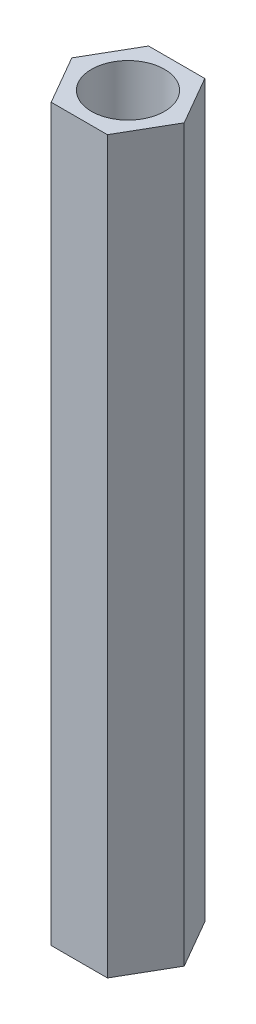
ISO-10303-21;
HEADER;
FILE_DESCRIPTION(('STEP AP214'),'2;1');
FILE_NAME('part.step','',(''),(''),'','','');
FILE_SCHEMA(('AUTOMOTIVE_DESIGN { 1 0 10303 214 1 1 1 1 }'));
ENDSEC;
DATA;
#1=APPLICATION_CONTEXT('core data for automotive mechanical design processes');
#2=APPLICATION_PROTOCOL_DEFINITION('international standard','automotive_design',2000,#1);
#3=PRODUCT_CONTEXT('',#1,'mechanical');
#4=PRODUCT('Part','Part','',(#3));
#5=PRODUCT_RELATED_PRODUCT_CATEGORY('part','',(#4));
#6=PRODUCT_DEFINITION_FORMATION('','',#4);
#7=PRODUCT_DEFINITION_CONTEXT('part definition',#1,'design');
#8=PRODUCT_DEFINITION('design','',#6,#7);
#9=PRODUCT_DEFINITION_SHAPE('','',#8);
#10=(LENGTH_UNIT() NAMED_UNIT(*) SI_UNIT(.MILLI.,.METRE.));
#11=(NAMED_UNIT(*) PLANE_ANGLE_UNIT() SI_UNIT($,.RADIAN.));
#12=(NAMED_UNIT(*) SI_UNIT($,.STERADIAN.) SOLID_ANGLE_UNIT());
#13=UNCERTAINTY_MEASURE_WITH_UNIT(LENGTH_MEASURE(1.E-05),#10,'distance_accuracy_value','');
#14=(GEOMETRIC_REPRESENTATION_CONTEXT(3) GLOBAL_UNCERTAINTY_ASSIGNED_CONTEXT((#13)) GLOBAL_UNIT_ASSIGNED_CONTEXT((#10,
#11,#12)) REPRESENTATION_CONTEXT('',''));
#15=CARTESIAN_POINT('',(0.,0.,0.));
#16=DIRECTION('',(0.,0.,1.));
#17=DIRECTION('',(1.,0.,0.));
#18=AXIS2_PLACEMENT_3D('',#15,#16,#17);
#19=CARTESIAN_POINT('',(1.15470053837925,30.,2.));
#20=DIRECTION('',(-0.866025403784439,0.,-0.5));
#21=DIRECTION('',(-0.5,0.,0.866025403784439));
#22=AXIS2_PLACEMENT_3D('',#19,#20,#21);
#23=PLANE('',#22);
#24=DIRECTION('',(0.5,0.,-0.866025403784439));
#25=VECTOR('',#24,1.);
#26=CARTESIAN_POINT('',(1.15470053837925,0.,2.));
#27=LINE('',#26,#25);
#28=CARTESIAN_POINT('',(1.15470053837925,0.,2.));
#29=VERTEX_POINT('',#28);
#30=CARTESIAN_POINT('',(2.3094010767585,0.,0.));
#31=VERTEX_POINT('',#30);
#32=EDGE_CURVE('E132',#29,#31,#27,.T.);
#33=ORIENTED_EDGE('',*,*,#32,.T.);
#34=DIRECTION('',(0.,-1.,0.));
#35=VECTOR('',#34,1.);
#36=CARTESIAN_POINT('',(2.3094010767585,30.,0.));
#37=LINE('',#36,#35);
#38=CARTESIAN_POINT('',(2.3094010767585,30.,0.));
#39=VERTEX_POINT('',#38);
#40=EDGE_CURVE('E11',#39,#31,#37,.T.);
#41=ORIENTED_EDGE('',*,*,#40,.F.);
#42=DIRECTION('',(0.5,0.,-0.866025403784439));
#43=VECTOR('',#42,1.);
#44=CARTESIAN_POINT('',(1.15470053837925,30.,2.));
#45=LINE('',#44,#43);
#46=CARTESIAN_POINT('',(1.15470053837925,30.,2.));
#47=VERTEX_POINT('',#46);
#48=EDGE_CURVE('E149',#47,#39,#45,.T.);
#49=ORIENTED_EDGE('',*,*,#48,.F.);
#50=DIRECTION('',(0.,-1.,0.));
#51=VECTOR('',#50,1.);
#52=CARTESIAN_POINT('',(1.15470053837925,30.,2.));
#53=LINE('',#52,#51);
#54=EDGE_CURVE('E128',#47,#29,#53,.T.);
#55=ORIENTED_EDGE('',*,*,#54,.T.);
#56=EDGE_LOOP('',(#33,#41,#49,#55));
#57=FACE_BOUND('',#56,.T.);
#58=ADVANCED_FACE('F43',(#57),#23,.F.);
#59=CARTESIAN_POINT('',(2.3094010767585,30.,0.));
#60=DIRECTION('',(-0.866025403784438,0.,0.5));
#61=DIRECTION('',(0.5,0.,0.866025403784439));
#62=AXIS2_PLACEMENT_3D('',#59,#60,#61);
#63=PLANE('',#62);
#64=DIRECTION('',(-0.5,0.,-0.866025403784438));
#65=VECTOR('',#64,1.);
#66=CARTESIAN_POINT('',(2.3094010767585,0.,0.));
#67=LINE('',#66,#65);
#68=CARTESIAN_POINT('',(1.15470053837925,0.,-2.));
#69=VERTEX_POINT('',#68);
#70=EDGE_CURVE('E136',#31,#69,#67,.T.);
#71=ORIENTED_EDGE('',*,*,#70,.T.);
#72=DIRECTION('',(0.,-1.,0.));
#73=VECTOR('',#72,1.);
#74=CARTESIAN_POINT('',(1.15470053837925,30.,-2.));
#75=LINE('',#74,#73);
#76=CARTESIAN_POINT('',(1.15470053837925,30.,-2.));
#77=VERTEX_POINT('',#76);
#78=EDGE_CURVE('E52',#77,#69,#75,.T.);
#79=ORIENTED_EDGE('',*,*,#78,.F.);
#80=DIRECTION('',(-0.5,0.,-0.866025403784438));
#81=VECTOR('',#80,1.);
#82=CARTESIAN_POINT('',(2.3094010767585,30.,0.));
#83=LINE('',#82,#81);
#84=EDGE_CURVE('E97',#39,#77,#83,.T.);
#85=ORIENTED_EDGE('',*,*,#84,.F.);
#86=ORIENTED_EDGE('',*,*,#40,.T.);
#87=EDGE_LOOP('',(#71,#79,#85,#86));
#88=FACE_BOUND('',#87,.T.);
#89=ADVANCED_FACE('F178',(#88),#63,.F.);
#90=CARTESIAN_POINT('',(1.15470053837925,30.,-2.));
#91=DIRECTION('',(0.,0.,1.));
#92=DIRECTION('',(1.,0.,0.));
#93=AXIS2_PLACEMENT_3D('',#90,#91,#92);
#94=PLANE('',#93);
#95=DIRECTION('',(-1.,0.,0.));
#96=VECTOR('',#95,1.);
#97=CARTESIAN_POINT('',(1.15470053837925,0.,-2.));
#98=LINE('',#97,#96);
#99=CARTESIAN_POINT('',(-1.15470053837925,0.,-2.));
#100=VERTEX_POINT('',#99);
#101=EDGE_CURVE('E140',#69,#100,#98,.T.);
#102=ORIENTED_EDGE('',*,*,#101,.T.);
#103=DIRECTION('',(0.,-1.,0.));
#104=VECTOR('',#103,1.);
#105=CARTESIAN_POINT('',(-1.15470053837925,30.,-2.));
#106=LINE('',#105,#104);
#107=CARTESIAN_POINT('',(-1.15470053837925,30.,-2.));
#108=VERTEX_POINT('',#107);
#109=EDGE_CURVE('E121',#108,#100,#106,.T.);
#110=ORIENTED_EDGE('',*,*,#109,.F.);
#111=DIRECTION('',(-1.,0.,0.));
#112=VECTOR('',#111,1.);
#113=CARTESIAN_POINT('',(1.15470053837925,30.,-2.));
#114=LINE('',#113,#112);
#115=EDGE_CURVE('E110',#77,#108,#114,.T.);
#116=ORIENTED_EDGE('',*,*,#115,.F.);
#117=ORIENTED_EDGE('',*,*,#78,.T.);
#118=EDGE_LOOP('',(#102,#110,#116,#117));
#119=FACE_BOUND('',#118,.T.);
#120=ADVANCED_FACE('F159',(#119),#94,.F.);
#121=CARTESIAN_POINT('',(-1.15470053837925,30.,-2.));
#122=DIRECTION('',(0.866025403784439,0.,0.5));
#123=DIRECTION('',(0.5,0.,-0.866025403784439));
#124=AXIS2_PLACEMENT_3D('',#121,#122,#123);
#125=PLANE('',#124);
#126=DIRECTION('',(-0.5,0.,0.866025403784439));
#127=VECTOR('',#126,1.);
#128=CARTESIAN_POINT('',(-1.15470053837925,0.,-2.));
#129=LINE('',#128,#127);
#130=CARTESIAN_POINT('',(-2.3094010767585,0.,0.));
#131=VERTEX_POINT('',#130);
#132=EDGE_CURVE('E119',#100,#131,#129,.T.);
#133=ORIENTED_EDGE('',*,*,#132,.T.);
#134=DIRECTION('',(0.,-1.,0.));
#135=VECTOR('',#134,1.);
#136=CARTESIAN_POINT('',(-2.3094010767585,30.,0.));
#137=LINE('',#136,#135);
#138=CARTESIAN_POINT('',(-2.3094010767585,30.,0.));
#139=VERTEX_POINT('',#138);
#140=EDGE_CURVE('E116',#139,#131,#137,.T.);
#141=ORIENTED_EDGE('',*,*,#140,.F.);
#142=DIRECTION('',(-0.5,0.,0.866025403784439));
#143=VECTOR('',#142,1.);
#144=CARTESIAN_POINT('',(-1.15470053837925,30.,-2.));
#145=LINE('',#144,#143);
#146=EDGE_CURVE('E104',#108,#139,#145,.T.);
#147=ORIENTED_EDGE('',*,*,#146,.F.);
#148=ORIENTED_EDGE('',*,*,#109,.T.);
#149=EDGE_LOOP('',(#133,#141,#147,#148));
#150=FACE_BOUND('',#149,.T.);
#151=ADVANCED_FACE('F117',(#150),#125,.F.);
#152=CARTESIAN_POINT('',(-2.3094010767585,30.,0.));
#153=DIRECTION('',(0.866025403784439,0.,-0.5));
#154=DIRECTION('',(-0.5,0.,-0.866025403784439));
#155=AXIS2_PLACEMENT_3D('',#152,#153,#154);
#156=PLANE('',#155);
#157=DIRECTION('',(0.5,0.,0.866025403784439));
#158=VECTOR('',#157,1.);
#159=CARTESIAN_POINT('',(-2.3094010767585,0.,0.));
#160=LINE('',#159,#158);
#161=CARTESIAN_POINT('',(-1.15470053837925,0.,2.));
#162=VERTEX_POINT('',#161);
#163=EDGE_CURVE('E83',#131,#162,#160,.T.);
#164=ORIENTED_EDGE('',*,*,#163,.T.);
#165=DIRECTION('',(0.,-1.,0.));
#166=VECTOR('',#165,1.);
#167=CARTESIAN_POINT('',(-1.15470053837925,30.,2.));
#168=LINE('',#167,#166);
#169=CARTESIAN_POINT('',(-1.15470053837925,30.,2.));
#170=VERTEX_POINT('',#169);
#171=EDGE_CURVE('E122',#170,#162,#168,.T.);
#172=ORIENTED_EDGE('',*,*,#171,.F.);
#173=DIRECTION('',(0.5,0.,0.866025403784439));
#174=VECTOR('',#173,1.);
#175=CARTESIAN_POINT('',(-2.3094010767585,30.,0.));
#176=LINE('',#175,#174);
#177=EDGE_CURVE('E108',#139,#170,#176,.T.);
#178=ORIENTED_EDGE('',*,*,#177,.F.);
#179=ORIENTED_EDGE('',*,*,#140,.T.);
#180=EDGE_LOOP('',(#164,#172,#178,#179));
#181=FACE_BOUND('',#180,.T.);
#182=ADVANCED_FACE('F124',(#181),#156,.F.);
#183=CARTESIAN_POINT('',(-1.15470053837925,30.,2.));
#184=DIRECTION('',(0.,0.,-1.));
#185=DIRECTION('',(-1.,0.,0.));
#186=AXIS2_PLACEMENT_3D('',#183,#184,#185);
#187=PLANE('',#186);
#188=DIRECTION('',(1.,0.,0.));
#189=VECTOR('',#188,1.);
#190=CARTESIAN_POINT('',(-1.15470053837925,0.,2.));
#191=LINE('',#190,#189);
#192=EDGE_CURVE('E89',#162,#29,#191,.T.);
#193=ORIENTED_EDGE('',*,*,#192,.T.);
#194=ORIENTED_EDGE('',*,*,#54,.F.);
#195=DIRECTION('',(1.,0.,0.));
#196=VECTOR('',#195,1.);
#197=CARTESIAN_POINT('',(-1.15470053837925,30.,2.));
#198=LINE('',#197,#196);
#199=EDGE_CURVE('E60',#170,#47,#198,.T.);
#200=ORIENTED_EDGE('',*,*,#199,.F.);
#201=ORIENTED_EDGE('',*,*,#171,.T.);
#202=EDGE_LOOP('',(#193,#194,#200,#201));
#203=FACE_BOUND('',#202,.T.);
#204=ADVANCED_FACE('F166',(#203),#187,.F.);
#205=CARTESIAN_POINT('',(0.,30.,0.));
#206=DIRECTION('',(0.,1.,0.));
#207=DIRECTION('',(0.,0.,1.));
#208=AXIS2_PLACEMENT_3D('',#205,#206,#207);
#209=PLANE('',#208);
#210=CARTESIAN_POINT('',(0.,30.,0.));
#211=DIRECTION('',(0.,1.,0.));
#212=DIRECTION('',(0.,0.,1.));
#213=AXIS2_PLACEMENT_3D('',#210,#211,#212);
#214=CIRCLE('',#213,1.5);
#215=CARTESIAN_POINT('',(0.,30.,1.5));
#216=VERTEX_POINT('',#215);
#217=EDGE_CURVE('E267',#216,#216,#214,.T.);
#218=ORIENTED_EDGE('',*,*,#217,.F.);
#219=EDGE_LOOP('',(#218));
#220=FACE_BOUND('',#219,.T.);
#221=ORIENTED_EDGE('',*,*,#48,.T.);
#222=ORIENTED_EDGE('',*,*,#84,.T.);
#223=ORIENTED_EDGE('',*,*,#115,.T.);
#224=ORIENTED_EDGE('',*,*,#146,.T.);
#225=ORIENTED_EDGE('',*,*,#177,.T.);
#226=ORIENTED_EDGE('',*,*,#199,.T.);
#227=EDGE_LOOP('',(#221,#222,#223,#224,#225,#226));
#228=FACE_BOUND('',#227,.T.);
#229=ADVANCED_FACE('F106',(#220,#228),#209,.T.);
#230=CARTESIAN_POINT('',(0.,0.,0.));
#231=DIRECTION('',(0.,1.,0.));
#232=DIRECTION('',(0.,0.,1.));
#233=AXIS2_PLACEMENT_3D('',#230,#231,#232);
#234=PLANE('',#233);
#235=CARTESIAN_POINT('',(0.,0.,0.));
#236=DIRECTION('',(0.,1.,0.));
#237=DIRECTION('',(0.,0.,1.));
#238=AXIS2_PLACEMENT_3D('',#235,#236,#237);
#239=CIRCLE('',#238,1.5);
#240=CARTESIAN_POINT('',(0.,0.,1.5));
#241=VERTEX_POINT('',#240);
#242=EDGE_CURVE('E137',#241,#241,#239,.T.);
#243=ORIENTED_EDGE('',*,*,#242,.T.);
#244=EDGE_LOOP('',(#243));
#245=FACE_BOUND('',#244,.T.);
#246=ORIENTED_EDGE('',*,*,#32,.F.);
#247=ORIENTED_EDGE('',*,*,#192,.F.);
#248=ORIENTED_EDGE('',*,*,#163,.F.);
#249=ORIENTED_EDGE('',*,*,#132,.F.);
#250=ORIENTED_EDGE('',*,*,#101,.F.);
#251=ORIENTED_EDGE('',*,*,#70,.F.);
#252=EDGE_LOOP('',(#246,#247,#248,#249,#250,#251));
#253=FACE_BOUND('',#252,.T.);
#254=ADVANCED_FACE('F162',(#245,#253),#234,.F.);
#255=CARTESIAN_POINT('',(0.,0.,0.));
#256=DIRECTION('',(0.,1.,0.));
#257=DIRECTION('',(0.,0.,1.));
#258=AXIS2_PLACEMENT_3D('',#255,#256,#257);
#259=CYLINDRICAL_SURFACE('',#258,1.5);
#260=ORIENTED_EDGE('',*,*,#242,.F.);
#261=EDGE_LOOP('',(#260));
#262=FACE_BOUND('',#261,.T.);
#263=ORIENTED_EDGE('',*,*,#217,.T.);
#264=EDGE_LOOP('',(#263));
#265=FACE_BOUND('',#264,.T.);
#266=ADVANCED_FACE('F220',(#262,#265),#259,.F.);
#267=CLOSED_SHELL('',(#58,#89,#120,#151,#182,#204,#229,#254,#266));
#268=MANIFOLD_SOLID_BREP('B2',#267);
#269=ADVANCED_BREP_SHAPE_REPRESENTATION('',(#18,#268),#14);
#270=SHAPE_DEFINITION_REPRESENTATION(#9,#269);
ENDSEC;
END-ISO-10303-21;
